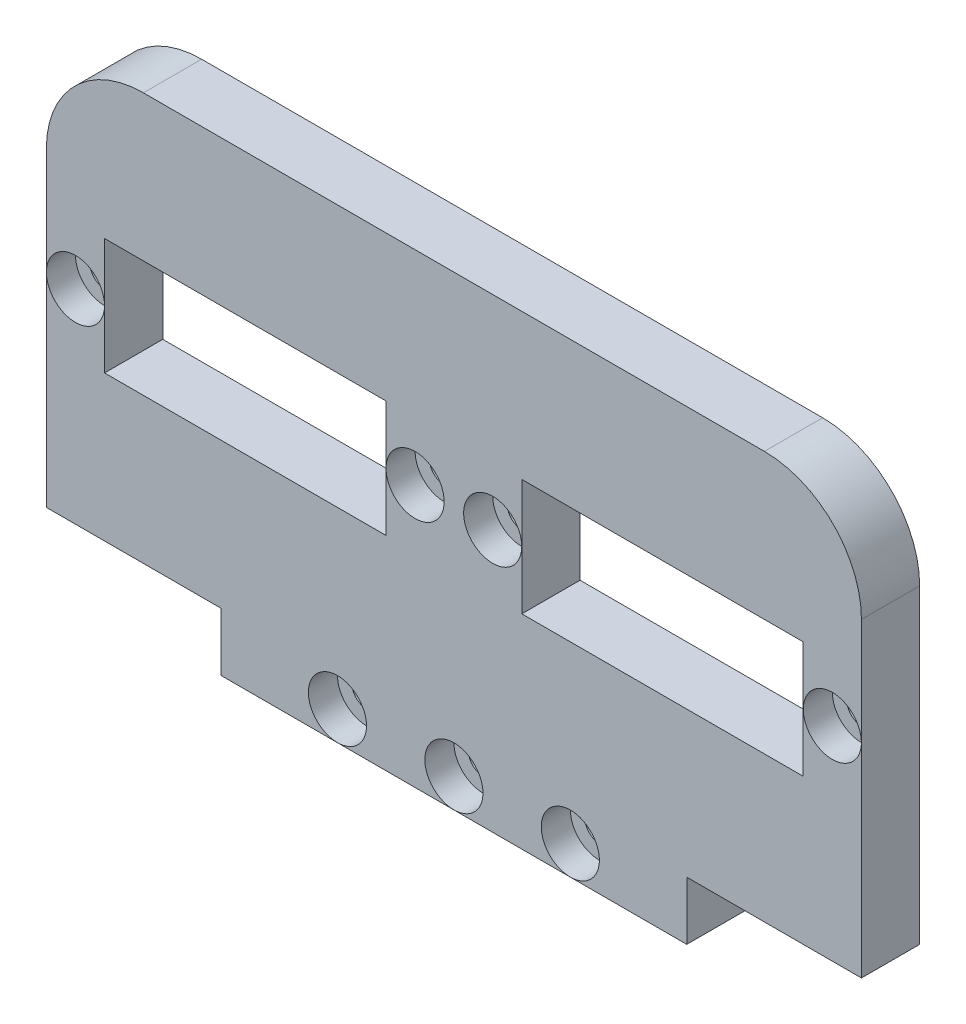
ISO-10303-21;
HEADER;
FILE_DESCRIPTION(('STEP AP214'),'2;1');
FILE_NAME('part.step','',(''),(''),'','','');
FILE_SCHEMA(('AUTOMOTIVE_DESIGN { 1 0 10303 214 1 1 1 1 }'));
ENDSEC;
DATA;
#1=APPLICATION_CONTEXT('core data for automotive mechanical design processes');
#2=APPLICATION_PROTOCOL_DEFINITION('international standard','automotive_design',2000,#1);
#3=PRODUCT_CONTEXT('',#1,'mechanical');
#4=PRODUCT('Part','Part','',(#3));
#5=PRODUCT_RELATED_PRODUCT_CATEGORY('part','',(#4));
#6=PRODUCT_DEFINITION_FORMATION('','',#4);
#7=PRODUCT_DEFINITION_CONTEXT('part definition',#1,'design');
#8=PRODUCT_DEFINITION('design','',#6,#7);
#9=PRODUCT_DEFINITION_SHAPE('','',#8);
#10=(LENGTH_UNIT() NAMED_UNIT(*) SI_UNIT(.MILLI.,.METRE.));
#11=(NAMED_UNIT(*) PLANE_ANGLE_UNIT() SI_UNIT($,.RADIAN.));
#12=(NAMED_UNIT(*) SI_UNIT($,.STERADIAN.) SOLID_ANGLE_UNIT());
#13=UNCERTAINTY_MEASURE_WITH_UNIT(LENGTH_MEASURE(1.E-05),#10,'distance_accuracy_value','');
#14=(GEOMETRIC_REPRESENTATION_CONTEXT(3) GLOBAL_UNCERTAINTY_ASSIGNED_CONTEXT((#13)) GLOBAL_UNIT_ASSIGNED_CONTEXT((#10,
#11,#12)) REPRESENTATION_CONTEXT('',''));
#15=CARTESIAN_POINT('',(0.,0.,0.));
#16=DIRECTION('',(0.,0.,1.));
#17=DIRECTION('',(1.,0.,0.));
#18=AXIS2_PLACEMENT_3D('',#15,#16,#17);
#19=CARTESIAN_POINT('',(49.587382635231,13.131926121372,0.));
#20=DIRECTION('',(0.,0.,1.));
#21=DIRECTION('',(1.,0.,0.));
#22=AXIS2_PLACEMENT_3D('',#19,#20,#21);
#23=CYLINDRICAL_SURFACE('',#22,1.5);
#24=CARTESIAN_POINT('',(49.587382635231,13.131926121372,0.));
#25=DIRECTION('',(0.,0.,1.));
#26=DIRECTION('',(1.,0.,0.));
#27=AXIS2_PLACEMENT_3D('',#24,#25,#26);
#28=CIRCLE('',#27,1.5);
#29=CARTESIAN_POINT('',(51.087382635231,13.131926121372,0.));
#30=VERTEX_POINT('',#29);
#31=EDGE_CURVE('E574',#30,#30,#28,.T.);
#32=ORIENTED_EDGE('',*,*,#31,.F.);
#33=EDGE_LOOP('',(#32));
#34=FACE_BOUND('',#33,.T.);
#35=CARTESIAN_POINT('',(49.587382635231,13.131926121372,3.));
#36=DIRECTION('',(0.,0.,1.));
#37=DIRECTION('',(1.,0.,0.));
#38=AXIS2_PLACEMENT_3D('',#35,#36,#37);
#39=CIRCLE('',#38,1.5);
#40=CARTESIAN_POINT('',(51.087382635231,13.131926121372,3.));
#41=VERTEX_POINT('',#40);
#42=EDGE_CURVE('E328',#41,#41,#39,.F.);
#43=ORIENTED_EDGE('',*,*,#42,.F.);
#44=EDGE_LOOP('',(#43));
#45=FACE_BOUND('',#44,.T.);
#46=ADVANCED_FACE('F35',(#34,#45),#23,.F.);
#47=CARTESIAN_POINT('',(14.587382635231,13.131926121372,0.));
#48=DIRECTION('',(0.,0.,1.));
#49=DIRECTION('',(1.,0.,0.));
#50=AXIS2_PLACEMENT_3D('',#47,#48,#49);
#51=CYLINDRICAL_SURFACE('',#50,1.5);
#52=CARTESIAN_POINT('',(14.587382635231,13.131926121372,0.));
#53=DIRECTION('',(0.,0.,1.));
#54=DIRECTION('',(1.,0.,0.));
#55=AXIS2_PLACEMENT_3D('',#52,#53,#54);
#56=CIRCLE('',#55,1.5);
#57=CARTESIAN_POINT('',(16.087382635231,13.131926121372,0.));
#58=VERTEX_POINT('',#57);
#59=EDGE_CURVE('E569',#58,#58,#56,.T.);
#60=ORIENTED_EDGE('',*,*,#59,.F.);
#61=EDGE_LOOP('',(#60));
#62=FACE_BOUND('',#61,.T.);
#63=CARTESIAN_POINT('',(14.587382635231,13.131926121372,3.));
#64=DIRECTION('',(0.,0.,1.));
#65=DIRECTION('',(1.,0.,0.));
#66=AXIS2_PLACEMENT_3D('',#63,#64,#65);
#67=CIRCLE('',#66,1.5);
#68=CARTESIAN_POINT('',(16.087382635231,13.131926121372,3.));
#69=VERTEX_POINT('',#68);
#70=EDGE_CURVE('E323',#69,#69,#67,.F.);
#71=ORIENTED_EDGE('',*,*,#70,.F.);
#72=EDGE_LOOP('',(#71));
#73=FACE_BOUND('',#72,.T.);
#74=ADVANCED_FACE('F387',(#62,#73),#51,.F.);
#75=CARTESIAN_POINT('',(6.58738263523099,13.131926121372,0.));
#76=DIRECTION('',(0.,0.,1.));
#77=DIRECTION('',(1.,0.,0.));
#78=AXIS2_PLACEMENT_3D('',#75,#76,#77);
#79=CYLINDRICAL_SURFACE('',#78,1.5);
#80=CARTESIAN_POINT('',(6.58738263523099,13.131926121372,0.));
#81=DIRECTION('',(0.,0.,1.));
#82=DIRECTION('',(1.,0.,0.));
#83=AXIS2_PLACEMENT_3D('',#80,#81,#82);
#84=CIRCLE('',#83,1.5);
#85=CARTESIAN_POINT('',(8.08738263523099,13.131926121372,0.));
#86=VERTEX_POINT('',#85);
#87=EDGE_CURVE('E572',#86,#86,#84,.T.);
#88=ORIENTED_EDGE('',*,*,#87,.F.);
#89=EDGE_LOOP('',(#88));
#90=FACE_BOUND('',#89,.T.);
#91=CARTESIAN_POINT('',(6.58738263523099,13.131926121372,3.));
#92=DIRECTION('',(0.,0.,1.));
#93=DIRECTION('',(1.,0.,0.));
#94=AXIS2_PLACEMENT_3D('',#91,#92,#93);
#95=CIRCLE('',#94,1.5);
#96=CARTESIAN_POINT('',(8.08738263523099,13.131926121372,3.));
#97=VERTEX_POINT('',#96);
#98=EDGE_CURVE('E318',#97,#97,#95,.F.);
#99=ORIENTED_EDGE('',*,*,#98,.F.);
#100=EDGE_LOOP('',(#99));
#101=FACE_BOUND('',#100,.T.);
#102=ADVANCED_FACE('F393',(#90,#101),#79,.F.);
#103=CARTESIAN_POINT('',(-28.412617364769,13.131926121372,0.));
#104=DIRECTION('',(0.,0.,1.));
#105=DIRECTION('',(1.,0.,0.));
#106=AXIS2_PLACEMENT_3D('',#103,#104,#105);
#107=CYLINDRICAL_SURFACE('',#106,1.5);
#108=CARTESIAN_POINT('',(-28.412617364769,13.131926121372,0.));
#109=DIRECTION('',(0.,0.,1.));
#110=DIRECTION('',(1.,0.,0.));
#111=AXIS2_PLACEMENT_3D('',#108,#109,#110);
#112=CIRCLE('',#111,1.5);
#113=CARTESIAN_POINT('',(-26.912617364769,13.131926121372,0.));
#114=VERTEX_POINT('',#113);
#115=EDGE_CURVE('E194',#114,#114,#112,.T.);
#116=ORIENTED_EDGE('',*,*,#115,.F.);
#117=EDGE_LOOP('',(#116));
#118=FACE_BOUND('',#117,.T.);
#119=CARTESIAN_POINT('',(-28.412617364769,13.131926121372,3.));
#120=DIRECTION('',(0.,0.,1.));
#121=DIRECTION('',(1.,0.,0.));
#122=AXIS2_PLACEMENT_3D('',#119,#120,#121);
#123=CIRCLE('',#122,1.5);
#124=CARTESIAN_POINT('',(-26.912617364769,13.131926121372,3.));
#125=VERTEX_POINT('',#124);
#126=EDGE_CURVE('E313',#125,#125,#123,.F.);
#127=ORIENTED_EDGE('',*,*,#126,.F.);
#128=EDGE_LOOP('',(#127));
#129=FACE_BOUND('',#128,.T.);
#130=ADVANCED_FACE('F400',(#118,#129),#107,.F.);
#131=CARTESIAN_POINT('',(10.587382635231,-10.868073878628,0.));
#132=DIRECTION('',(0.,0.,1.));
#133=DIRECTION('',(1.,0.,0.));
#134=AXIS2_PLACEMENT_3D('',#131,#132,#133);
#135=CYLINDRICAL_SURFACE('',#134,1.5);
#136=CARTESIAN_POINT('',(10.587382635231,-10.868073878628,0.));
#137=DIRECTION('',(0.,0.,1.));
#138=DIRECTION('',(1.,0.,0.));
#139=AXIS2_PLACEMENT_3D('',#136,#137,#138);
#140=CIRCLE('',#139,1.5);
#141=CARTESIAN_POINT('',(12.087382635231,-10.868073878628,0.));
#142=VERTEX_POINT('',#141);
#143=EDGE_CURVE('E301',#142,#142,#140,.T.);
#144=ORIENTED_EDGE('',*,*,#143,.F.);
#145=EDGE_LOOP('',(#144));
#146=FACE_BOUND('',#145,.T.);
#147=CARTESIAN_POINT('',(10.587382635231,-10.868073878628,3.));
#148=DIRECTION('',(0.,0.,1.));
#149=DIRECTION('',(1.,0.,0.));
#150=AXIS2_PLACEMENT_3D('',#147,#148,#149);
#151=CIRCLE('',#150,1.5);
#152=CARTESIAN_POINT('',(12.087382635231,-10.868073878628,3.));
#153=VERTEX_POINT('',#152);
#154=EDGE_CURVE('E308',#153,#153,#151,.F.);
#155=ORIENTED_EDGE('',*,*,#154,.F.);
#156=EDGE_LOOP('',(#155));
#157=FACE_BOUND('',#156,.T.);
#158=ADVANCED_FACE('F403',(#146,#157),#135,.F.);
#159=CARTESIAN_POINT('',(22.587382635231,-10.868073878628,0.));
#160=DIRECTION('',(0.,0.,1.));
#161=DIRECTION('',(1.,0.,0.));
#162=AXIS2_PLACEMENT_3D('',#159,#160,#161);
#163=CYLINDRICAL_SURFACE('',#162,1.5);
#164=CARTESIAN_POINT('',(22.587382635231,-10.868073878628,0.));
#165=DIRECTION('',(0.,0.,1.));
#166=DIRECTION('',(-1.,0.,0.));
#167=AXIS2_PLACEMENT_3D('',#164,#165,#166);
#168=CIRCLE('',#167,1.5);
#169=CARTESIAN_POINT('',(21.087382635231,-10.868073878628,0.));
#170=VERTEX_POINT('',#169);
#171=EDGE_CURVE('E563',#170,#170,#168,.T.);
#172=ORIENTED_EDGE('',*,*,#171,.F.);
#173=EDGE_LOOP('',(#172));
#174=FACE_BOUND('',#173,.T.);
#175=CARTESIAN_POINT('',(22.587382635231,-10.868073878628,3.));
#176=DIRECTION('',(0.,0.,1.));
#177=DIRECTION('',(1.,0.,0.));
#178=AXIS2_PLACEMENT_3D('',#175,#176,#177);
#179=CIRCLE('',#178,1.5);
#180=CARTESIAN_POINT('',(24.087382635231,-10.868073878628,3.));
#181=VERTEX_POINT('',#180);
#182=EDGE_CURVE('E303',#181,#181,#179,.F.);
#183=ORIENTED_EDGE('',*,*,#182,.F.);
#184=EDGE_LOOP('',(#183));
#185=FACE_BOUND('',#184,.T.);
#186=ADVANCED_FACE('F459',(#174,#185),#163,.F.);
#187=CARTESIAN_POINT('',(-1.412617364769,-10.868073878628,0.));
#188=DIRECTION('',(0.,0.,1.));
#189=DIRECTION('',(1.,0.,0.));
#190=AXIS2_PLACEMENT_3D('',#187,#188,#189);
#191=CYLINDRICAL_SURFACE('',#190,1.5);
#192=CARTESIAN_POINT('',(-1.412617364769,-10.868073878628,0.));
#193=DIRECTION('',(0.,0.,1.));
#194=DIRECTION('',(1.,0.,0.));
#195=AXIS2_PLACEMENT_3D('',#192,#193,#194);
#196=CIRCLE('',#195,1.5);
#197=CARTESIAN_POINT('',(0.0873826352310041,-10.868073878628,0.));
#198=VERTEX_POINT('',#197);
#199=EDGE_CURVE('E566',#198,#198,#196,.T.);
#200=ORIENTED_EDGE('',*,*,#199,.F.);
#201=EDGE_LOOP('',(#200));
#202=FACE_BOUND('',#201,.T.);
#203=CARTESIAN_POINT('',(-1.412617364769,-10.868073878628,3.));
#204=DIRECTION('',(0.,0.,1.));
#205=DIRECTION('',(1.,0.,0.));
#206=AXIS2_PLACEMENT_3D('',#203,#204,#205);
#207=CIRCLE('',#206,1.5);
#208=CARTESIAN_POINT('',(0.0873826352310041,-10.868073878628,3.));
#209=VERTEX_POINT('',#208);
#210=EDGE_CURVE('E298',#209,#209,#207,.F.);
#211=ORIENTED_EDGE('',*,*,#210,.F.);
#212=EDGE_LOOP('',(#211));
#213=FACE_BOUND('',#212,.T.);
#214=ADVANCED_FACE('F455',(#202,#213),#191,.F.);
#215=CARTESIAN_POINT('',(-31.412617364769,34.131926121372,6.));
#216=DIRECTION('',(1.,0.,0.));
#217=DIRECTION('',(0.,1.,0.));
#218=AXIS2_PLACEMENT_3D('',#215,#216,#217);
#219=PLANE('',#218);
#220=DIRECTION('',(0.,-1.,0.));
#221=VECTOR('',#220,1.);
#222=CARTESIAN_POINT('',(-31.412617364769,34.131926121372,6.));
#223=LINE('',#222,#221);
#224=CARTESIAN_POINT('',(-31.412617364769,24.131926121372,6.));
#225=VERTEX_POINT('',#224);
#226=CARTESIAN_POINT('',(-31.412617364769,-7.86807387862796,6.));
#227=VERTEX_POINT('',#226);
#228=EDGE_CURVE('E279',#225,#227,#223,.T.);
#229=ORIENTED_EDGE('',*,*,#228,.F.);
#230=DIRECTION('',(0.,0.,-1.));
#231=VECTOR('',#230,1.);
#232=CARTESIAN_POINT('',(-31.412617364769,24.131926121372,6.));
#233=LINE('',#232,#231);
#234=CARTESIAN_POINT('',(-31.412617364769,24.131926121372,0.));
#235=VERTEX_POINT('',#234);
#236=EDGE_CURVE('E11',#225,#235,#233,.T.);
#237=ORIENTED_EDGE('',*,*,#236,.T.);
#238=DIRECTION('',(0.,-1.,0.));
#239=VECTOR('',#238,1.);
#240=CARTESIAN_POINT('',(-31.412617364769,34.131926121372,0.));
#241=LINE('',#240,#239);
#242=CARTESIAN_POINT('',(-31.412617364769,-7.86807387862796,0.));
#243=VERTEX_POINT('',#242);
#244=EDGE_CURVE('E275',#235,#243,#241,.T.);
#245=ORIENTED_EDGE('',*,*,#244,.T.);
#246=DIRECTION('',(0.,0.,1.));
#247=VECTOR('',#246,1.);
#248=CARTESIAN_POINT('',(-31.412617364769,-7.86807387862796,0.));
#249=LINE('',#248,#247);
#250=EDGE_CURVE('E272',#243,#227,#249,.T.);
#251=ORIENTED_EDGE('',*,*,#250,.T.);
#252=EDGE_LOOP('',(#229,#237,#245,#251));
#253=FACE_BOUND('',#252,.T.);
#254=ADVANCED_FACE('F378',(#253),#219,.F.);
#255=CARTESIAN_POINT('',(-31.412617364769,-13.868073878628,6.));
#256=DIRECTION('',(0.,1.,0.));
#257=DIRECTION('',(0.,0.,1.));
#258=AXIS2_PLACEMENT_3D('',#255,#256,#257);
#259=PLANE('',#258);
#260=DIRECTION('',(1.,0.,0.));
#261=VECTOR('',#260,1.);
#262=CARTESIAN_POINT('',(-31.412617364769,-13.868073878628,0.));
#263=LINE('',#262,#261);
#264=CARTESIAN_POINT('',(-13.412617364769,-13.868073878628,0.));
#265=VERTEX_POINT('',#264);
#266=CARTESIAN_POINT('',(34.587382635231,-13.868073878628,0.));
#267=VERTEX_POINT('',#266);
#268=EDGE_CURVE('E291',#265,#267,#263,.T.);
#269=ORIENTED_EDGE('',*,*,#268,.T.);
#270=DIRECTION('',(0.,0.,1.));
#271=VECTOR('',#270,1.);
#272=CARTESIAN_POINT('',(34.587382635231,-13.868073878628,0.));
#273=LINE('',#272,#271);
#274=CARTESIAN_POINT('',(34.587382635231,-13.868073878628,6.));
#275=VERTEX_POINT('',#274);
#276=EDGE_CURVE('E253',#267,#275,#273,.T.);
#277=ORIENTED_EDGE('',*,*,#276,.T.);
#278=DIRECTION('',(1.,0.,0.));
#279=VECTOR('',#278,1.);
#280=CARTESIAN_POINT('',(-31.412617364769,-13.868073878628,6.));
#281=LINE('',#280,#279);
#282=CARTESIAN_POINT('',(-13.412617364769,-13.868073878628,6.));
#283=VERTEX_POINT('',#282);
#284=EDGE_CURVE('E281',#283,#275,#281,.T.);
#285=ORIENTED_EDGE('',*,*,#284,.F.);
#286=DIRECTION('',(0.,0.,1.));
#287=VECTOR('',#286,1.);
#288=CARTESIAN_POINT('',(-13.412617364769,-13.868073878628,0.));
#289=LINE('',#288,#287);
#290=EDGE_CURVE('E267',#265,#283,#289,.T.);
#291=ORIENTED_EDGE('',*,*,#290,.F.);
#292=EDGE_LOOP('',(#269,#277,#285,#291));
#293=FACE_BOUND('',#292,.T.);
#294=ADVANCED_FACE('F366',(#293),#259,.F.);
#295=CARTESIAN_POINT('',(52.587382635231,34.131926121372,6.));
#296=DIRECTION('',(-1.,0.,0.));
#297=DIRECTION('',(0.,0.,1.));
#298=AXIS2_PLACEMENT_3D('',#295,#296,#297);
#299=PLANE('',#298);
#300=DIRECTION('',(0.,1.,0.));
#301=VECTOR('',#300,1.);
#302=CARTESIAN_POINT('',(52.587382635231,34.131926121372,0.));
#303=LINE('',#302,#301);
#304=CARTESIAN_POINT('',(52.587382635231,-7.86807387862796,0.));
#305=VERTEX_POINT('',#304);
#306=CARTESIAN_POINT('',(52.587382635231,24.131926121372,0.));
#307=VERTEX_POINT('',#306);
#308=EDGE_CURVE('E294',#305,#307,#303,.T.);
#309=ORIENTED_EDGE('',*,*,#308,.T.);
#310=DIRECTION('',(0.,0.,-1.));
#311=VECTOR('',#310,1.);
#312=CARTESIAN_POINT('',(52.587382635231,24.131926121372,6.));
#313=LINE('',#312,#311);
#314=CARTESIAN_POINT('',(52.587382635231,24.131926121372,6.));
#315=VERTEX_POINT('',#314);
#316=EDGE_CURVE('E58',#307,#315,#313,.F.);
#317=ORIENTED_EDGE('',*,*,#316,.T.);
#318=DIRECTION('',(0.,1.,0.));
#319=VECTOR('',#318,1.);
#320=CARTESIAN_POINT('',(52.587382635231,34.131926121372,6.));
#321=LINE('',#320,#319);
#322=CARTESIAN_POINT('',(52.587382635231,-7.86807387862796,6.));
#323=VERTEX_POINT('',#322);
#324=EDGE_CURVE('E285',#323,#315,#321,.T.);
#325=ORIENTED_EDGE('',*,*,#324,.F.);
#326=DIRECTION('',(0.,0.,1.));
#327=VECTOR('',#326,1.);
#328=CARTESIAN_POINT('',(52.587382635231,-7.86807387862796,0.));
#329=LINE('',#328,#327);
#330=EDGE_CURVE('E249',#305,#323,#329,.T.);
#331=ORIENTED_EDGE('',*,*,#330,.F.);
#332=EDGE_LOOP('',(#309,#317,#325,#331));
#333=FACE_BOUND('',#332,.T.);
#334=ADVANCED_FACE('F356',(#333),#299,.F.);
#335=CARTESIAN_POINT('',(-31.412617364769,34.131926121372,6.));
#336=DIRECTION('',(0.,-1.,0.));
#337=DIRECTION('',(0.,0.,-1.));
#338=AXIS2_PLACEMENT_3D('',#335,#336,#337);
#339=PLANE('',#338);
#340=DIRECTION('',(-1.,0.,0.));
#341=VECTOR('',#340,1.);
#342=CARTESIAN_POINT('',(-31.412617364769,34.131926121372,6.));
#343=LINE('',#342,#341);
#344=CARTESIAN_POINT('',(42.587382635231,34.131926121372,6.));
#345=VERTEX_POINT('',#344);
#346=CARTESIAN_POINT('',(-21.412617364769,34.131926121372,6.));
#347=VERTEX_POINT('',#346);
#348=EDGE_CURVE('E287',#345,#347,#343,.T.);
#349=ORIENTED_EDGE('',*,*,#348,.F.);
#350=DIRECTION('',(0.,0.,-1.));
#351=VECTOR('',#350,1.);
#352=CARTESIAN_POINT('',(42.587382635231,34.131926121372,6.));
#353=LINE('',#352,#351);
#354=CARTESIAN_POINT('',(42.587382635231,34.131926121372,0.));
#355=VERTEX_POINT('',#354);
#356=EDGE_CURVE('E334',#345,#355,#353,.T.);
#357=ORIENTED_EDGE('',*,*,#356,.T.);
#358=DIRECTION('',(-1.,0.,0.));
#359=VECTOR('',#358,1.);
#360=CARTESIAN_POINT('',(-31.412617364769,34.131926121372,0.));
#361=LINE('',#360,#359);
#362=CARTESIAN_POINT('',(-21.412617364769,34.131926121372,0.));
#363=VERTEX_POINT('',#362);
#364=EDGE_CURVE('E282',#355,#363,#361,.T.);
#365=ORIENTED_EDGE('',*,*,#364,.T.);
#366=DIRECTION('',(0.,0.,-1.));
#367=VECTOR('',#366,1.);
#368=CARTESIAN_POINT('',(-21.412617364769,34.131926121372,6.));
#369=LINE('',#368,#367);
#370=EDGE_CURVE('E289',#363,#347,#369,.F.);
#371=ORIENTED_EDGE('',*,*,#370,.T.);
#372=EDGE_LOOP('',(#349,#357,#365,#371));
#373=FACE_BOUND('',#372,.T.);
#374=ADVANCED_FACE('F349',(#373),#339,.F.);
#375=CARTESIAN_POINT('',(0.,0.,6.));
#376=DIRECTION('',(0.,0.,1.));
#377=DIRECTION('',(1.,0.,0.));
#378=AXIS2_PLACEMENT_3D('',#375,#376,#377);
#379=PLANE('',#378);
#380=CARTESIAN_POINT('',(49.587382635231,13.131926121372,6.));
#381=DIRECTION('',(0.,0.,1.));
#382=DIRECTION('',(1.,0.,0.));
#383=AXIS2_PLACEMENT_3D('',#380,#381,#382);
#384=CIRCLE('',#383,2.995);
#385=CARTESIAN_POINT('',(52.582382635231,13.131926121372,6.));
#386=VERTEX_POINT('',#385);
#387=EDGE_CURVE('E532',#386,#386,#384,.T.);
#388=ORIENTED_EDGE('',*,*,#387,.F.);
#389=EDGE_LOOP('',(#388));
#390=FACE_BOUND('',#389,.T.);
#391=CARTESIAN_POINT('',(14.587382635231,13.131926121372,6.));
#392=DIRECTION('',(0.,0.,1.));
#393=DIRECTION('',(1.,0.,0.));
#394=AXIS2_PLACEMENT_3D('',#391,#392,#393);
#395=CIRCLE('',#394,2.995);
#396=CARTESIAN_POINT('',(17.582382635231,13.131926121372,6.));
#397=VERTEX_POINT('',#396);
#398=EDGE_CURVE('E331',#397,#397,#395,.T.);
#399=ORIENTED_EDGE('',*,*,#398,.F.);
#400=EDGE_LOOP('',(#399));
#401=FACE_BOUND('',#400,.T.);
#402=CARTESIAN_POINT('',(6.58738263523099,13.131926121372,6.));
#403=DIRECTION('',(0.,0.,1.));
#404=DIRECTION('',(1.,0.,0.));
#405=AXIS2_PLACEMENT_3D('',#402,#403,#404);
#406=CIRCLE('',#405,2.995);
#407=CARTESIAN_POINT('',(9.58238263523099,13.131926121372,6.));
#408=VERTEX_POINT('',#407);
#409=EDGE_CURVE('E326',#408,#408,#406,.T.);
#410=ORIENTED_EDGE('',*,*,#409,.F.);
#411=EDGE_LOOP('',(#410));
#412=FACE_BOUND('',#411,.T.);
#413=CARTESIAN_POINT('',(-28.412617364769,13.131926121372,6.));
#414=DIRECTION('',(0.,0.,1.));
#415=DIRECTION('',(1.,0.,0.));
#416=AXIS2_PLACEMENT_3D('',#413,#414,#415);
#417=CIRCLE('',#416,2.995);
#418=CARTESIAN_POINT('',(-25.417617364769,13.131926121372,6.));
#419=VERTEX_POINT('',#418);
#420=EDGE_CURVE('E321',#419,#419,#417,.T.);
#421=ORIENTED_EDGE('',*,*,#420,.F.);
#422=EDGE_LOOP('',(#421));
#423=FACE_BOUND('',#422,.T.);
#424=CARTESIAN_POINT('',(10.587382635231,-10.868073878628,6.));
#425=DIRECTION('',(0.,0.,1.));
#426=DIRECTION('',(1.,0.,0.));
#427=AXIS2_PLACEMENT_3D('',#424,#425,#426);
#428=CIRCLE('',#427,2.995);
#429=CARTESIAN_POINT('',(13.582382635231,-10.868073878628,6.));
#430=VERTEX_POINT('',#429);
#431=EDGE_CURVE('E316',#430,#430,#428,.T.);
#432=ORIENTED_EDGE('',*,*,#431,.F.);
#433=EDGE_LOOP('',(#432));
#434=FACE_BOUND('',#433,.T.);
#435=CARTESIAN_POINT('',(22.587382635231,-10.868073878628,6.));
#436=DIRECTION('',(0.,0.,1.));
#437=DIRECTION('',(1.,0.,0.));
#438=AXIS2_PLACEMENT_3D('',#435,#436,#437);
#439=CIRCLE('',#438,2.995);
#440=CARTESIAN_POINT('',(25.582382635231,-10.868073878628,6.));
#441=VERTEX_POINT('',#440);
#442=EDGE_CURVE('E311',#441,#441,#439,.T.);
#443=ORIENTED_EDGE('',*,*,#442,.F.);
#444=EDGE_LOOP('',(#443));
#445=FACE_BOUND('',#444,.T.);
#446=CARTESIAN_POINT('',(-1.412617364769,-10.868073878628,6.));
#447=DIRECTION('',(0.,0.,1.));
#448=DIRECTION('',(1.,0.,0.));
#449=AXIS2_PLACEMENT_3D('',#446,#447,#448);
#450=CIRCLE('',#449,2.995);
#451=CARTESIAN_POINT('',(1.582382635231,-10.868073878628,6.));
#452=VERTEX_POINT('',#451);
#453=EDGE_CURVE('E306',#452,#452,#450,.T.);
#454=ORIENTED_EDGE('',*,*,#453,.F.);
#455=EDGE_LOOP('',(#454));
#456=FACE_BOUND('',#455,.T.);
#457=DIRECTION('',(0.,-1.,0.));
#458=VECTOR('',#457,1.);
#459=CARTESIAN_POINT('',(17.587382635231,19.131926121372,6.));
#460=LINE('',#459,#458);
#461=CARTESIAN_POINT('',(17.587382635231,19.131926121372,6.));
#462=VERTEX_POINT('',#461);
#463=CARTESIAN_POINT('',(17.587382635231,7.13192612137204,6.));
#464=VERTEX_POINT('',#463);
#465=EDGE_CURVE('E170',#462,#464,#460,.T.);
#466=ORIENTED_EDGE('',*,*,#465,.F.);
#467=DIRECTION('',(-1.,0.,0.));
#468=VECTOR('',#467,1.);
#469=CARTESIAN_POINT('',(17.587382635231,19.131926121372,6.));
#470=LINE('',#469,#468);
#471=CARTESIAN_POINT('',(46.587382635231,19.131926121372,6.));
#472=VERTEX_POINT('',#471);
#473=EDGE_CURVE('E188',#472,#462,#470,.T.);
#474=ORIENTED_EDGE('',*,*,#473,.F.);
#475=DIRECTION('',(0.,1.,0.));
#476=VECTOR('',#475,1.);
#477=CARTESIAN_POINT('',(46.587382635231,19.131926121372,6.));
#478=LINE('',#477,#476);
#479=CARTESIAN_POINT('',(46.587382635231,7.13192612137204,6.));
#480=VERTEX_POINT('',#479);
#481=EDGE_CURVE('E191',#480,#472,#478,.T.);
#482=ORIENTED_EDGE('',*,*,#481,.F.);
#483=DIRECTION('',(1.,0.,0.));
#484=VECTOR('',#483,1.);
#485=CARTESIAN_POINT('',(17.587382635231,7.13192612137204,6.));
#486=LINE('',#485,#484);
#487=EDGE_CURVE('E200',#464,#480,#486,.T.);
#488=ORIENTED_EDGE('',*,*,#487,.F.);
#489=EDGE_LOOP('',(#466,#474,#482,#488));
#490=FACE_BOUND('',#489,.T.);
#491=DIRECTION('',(0.,-1.,0.));
#492=VECTOR('',#491,1.);
#493=CARTESIAN_POINT('',(-25.412617364769,19.131926121372,6.));
#494=LINE('',#493,#492);
#495=CARTESIAN_POINT('',(-25.412617364769,19.131926121372,6.));
#496=VERTEX_POINT('',#495);
#497=CARTESIAN_POINT('',(-25.412617364769,7.13192612137204,6.));
#498=VERTEX_POINT('',#497);
#499=EDGE_CURVE('E206',#496,#498,#494,.T.);
#500=ORIENTED_EDGE('',*,*,#499,.F.);
#501=DIRECTION('',(-1.,0.,0.));
#502=VECTOR('',#501,1.);
#503=CARTESIAN_POINT('',(-25.412617364769,19.131926121372,6.));
#504=LINE('',#503,#502);
#505=CARTESIAN_POINT('',(3.58738263523099,19.131926121372,6.));
#506=VERTEX_POINT('',#505);
#507=EDGE_CURVE('E214',#506,#496,#504,.T.);
#508=ORIENTED_EDGE('',*,*,#507,.F.);
#509=DIRECTION('',(0.,1.,0.));
#510=VECTOR('',#509,1.);
#511=CARTESIAN_POINT('',(3.58738263523099,19.131926121372,6.));
#512=LINE('',#511,#510);
#513=CARTESIAN_POINT('',(3.58738263523099,7.13192612137204,6.));
#514=VERTEX_POINT('',#513);
#515=EDGE_CURVE('E228',#514,#506,#512,.T.);
#516=ORIENTED_EDGE('',*,*,#515,.F.);
#517=DIRECTION('',(1.,0.,0.));
#518=VECTOR('',#517,1.);
#519=CARTESIAN_POINT('',(-25.412617364769,7.13192612137204,6.));
#520=LINE('',#519,#518);
#521=EDGE_CURVE('E225',#498,#514,#520,.T.);
#522=ORIENTED_EDGE('',*,*,#521,.F.);
#523=EDGE_LOOP('',(#500,#508,#516,#522));
#524=FACE_BOUND('',#523,.T.);
#525=ORIENTED_EDGE('',*,*,#324,.T.);
#526=CARTESIAN_POINT('',(42.587382635231,24.131926121372,6.));
#527=DIRECTION('',(0.,0.,1.));
#528=DIRECTION('',(1.,0.,0.));
#529=AXIS2_PLACEMENT_3D('',#526,#527,#528);
#530=CIRCLE('',#529,10.);
#531=EDGE_CURVE('E43',#315,#345,#530,.T.);
#532=ORIENTED_EDGE('',*,*,#531,.T.);
#533=ORIENTED_EDGE('',*,*,#348,.T.);
#534=CARTESIAN_POINT('',(-21.412617364769,24.131926121372,6.));
#535=DIRECTION('',(0.,0.,1.));
#536=DIRECTION('',(1.,0.,0.));
#537=AXIS2_PLACEMENT_3D('',#534,#535,#536);
#538=CIRCLE('',#537,10.);
#539=EDGE_CURVE('E50',#347,#225,#538,.T.);
#540=ORIENTED_EDGE('',*,*,#539,.T.);
#541=ORIENTED_EDGE('',*,*,#228,.T.);
#542=DIRECTION('',(-1.,0.,0.));
#543=VECTOR('',#542,1.);
#544=CARTESIAN_POINT('',(-31.412617364769,-7.86807387862796,6.));
#545=LINE('',#544,#543);
#546=CARTESIAN_POINT('',(-13.412617364769,-7.86807387862796,6.));
#547=VERTEX_POINT('',#546);
#548=EDGE_CURVE('E264',#547,#227,#545,.T.);
#549=ORIENTED_EDGE('',*,*,#548,.F.);
#550=DIRECTION('',(0.,1.,0.));
#551=VECTOR('',#550,1.);
#552=CARTESIAN_POINT('',(-13.412617364769,-13.868073878628,6.));
#553=LINE('',#552,#551);
#554=EDGE_CURVE('E256',#283,#547,#553,.T.);
#555=ORIENTED_EDGE('',*,*,#554,.F.);
#556=ORIENTED_EDGE('',*,*,#284,.T.);
#557=DIRECTION('',(0.,-1.,0.));
#558=VECTOR('',#557,1.);
#559=CARTESIAN_POINT('',(34.587382635231,-13.868073878628,6.));
#560=LINE('',#559,#558);
#561=CARTESIAN_POINT('',(34.587382635231,-7.86807387862796,6.));
#562=VERTEX_POINT('',#561);
#563=EDGE_CURVE('E246',#562,#275,#560,.T.);
#564=ORIENTED_EDGE('',*,*,#563,.F.);
#565=DIRECTION('',(-1.,0.,0.));
#566=VECTOR('',#565,1.);
#567=CARTESIAN_POINT('',(52.587382635231,-7.86807387862796,6.));
#568=LINE('',#567,#566);
#569=EDGE_CURVE('E235',#323,#562,#568,.T.);
#570=ORIENTED_EDGE('',*,*,#569,.F.);
#571=EDGE_LOOP('',(#525,#532,#533,#540,#541,#549,#555,#556,#564,#570));
#572=FACE_BOUND('',#571,.T.);
#573=ADVANCED_FACE('F344',(#390,#401,#412,#423,#434,#445,#456,#490,#524,#572),#379,.T.);
#574=CARTESIAN_POINT('',(0.,0.,0.));
#575=DIRECTION('',(0.,0.,1.));
#576=DIRECTION('',(1.,0.,0.));
#577=AXIS2_PLACEMENT_3D('',#574,#575,#576);
#578=PLANE('',#577);
#579=ORIENTED_EDGE('',*,*,#143,.T.);
#580=EDGE_LOOP('',(#579));
#581=FACE_BOUND('',#580,.T.);
#582=ORIENTED_EDGE('',*,*,#171,.T.);
#583=EDGE_LOOP('',(#582));
#584=FACE_BOUND('',#583,.T.);
#585=ORIENTED_EDGE('',*,*,#199,.T.);
#586=EDGE_LOOP('',(#585));
#587=FACE_BOUND('',#586,.T.);
#588=ORIENTED_EDGE('',*,*,#59,.T.);
#589=EDGE_LOOP('',(#588));
#590=FACE_BOUND('',#589,.T.);
#591=ORIENTED_EDGE('',*,*,#87,.T.);
#592=EDGE_LOOP('',(#591));
#593=FACE_BOUND('',#592,.T.);
#594=ORIENTED_EDGE('',*,*,#31,.T.);
#595=EDGE_LOOP('',(#594));
#596=FACE_BOUND('',#595,.T.);
#597=ORIENTED_EDGE('',*,*,#115,.T.);
#598=EDGE_LOOP('',(#597));
#599=FACE_BOUND('',#598,.T.);
#600=DIRECTION('',(-1.,0.,0.));
#601=VECTOR('',#600,1.);
#602=CARTESIAN_POINT('',(17.587382635231,19.131926121372,0.));
#603=LINE('',#602,#601);
#604=CARTESIAN_POINT('',(46.587382635231,19.131926121372,0.));
#605=VERTEX_POINT('',#604);
#606=CARTESIAN_POINT('',(17.587382635231,19.131926121372,0.));
#607=VERTEX_POINT('',#606);
#608=EDGE_CURVE('E175',#605,#607,#603,.T.);
#609=ORIENTED_EDGE('',*,*,#608,.T.);
#610=DIRECTION('',(0.,-1.,0.));
#611=VECTOR('',#610,1.);
#612=CARTESIAN_POINT('',(17.587382635231,19.131926121372,0.));
#613=LINE('',#612,#611);
#614=CARTESIAN_POINT('',(17.587382635231,7.13192612137204,0.));
#615=VERTEX_POINT('',#614);
#616=EDGE_CURVE('E167',#607,#615,#613,.T.);
#617=ORIENTED_EDGE('',*,*,#616,.T.);
#618=DIRECTION('',(1.,0.,0.));
#619=VECTOR('',#618,1.);
#620=CARTESIAN_POINT('',(17.587382635231,7.13192612137204,0.));
#621=LINE('',#620,#619);
#622=CARTESIAN_POINT('',(46.587382635231,7.13192612137204,0.));
#623=VERTEX_POINT('',#622);
#624=EDGE_CURVE('E179',#615,#623,#621,.T.);
#625=ORIENTED_EDGE('',*,*,#624,.T.);
#626=DIRECTION('',(0.,1.,0.));
#627=VECTOR('',#626,1.);
#628=CARTESIAN_POINT('',(46.587382635231,19.131926121372,0.));
#629=LINE('',#628,#627);
#630=EDGE_CURVE('E183',#623,#605,#629,.T.);
#631=ORIENTED_EDGE('',*,*,#630,.T.);
#632=EDGE_LOOP('',(#609,#617,#625,#631));
#633=FACE_BOUND('',#632,.T.);
#634=DIRECTION('',(-1.,0.,0.));
#635=VECTOR('',#634,1.);
#636=CARTESIAN_POINT('',(-25.412617364769,19.131926121372,0.));
#637=LINE('',#636,#635);
#638=CARTESIAN_POINT('',(3.58738263523099,19.131926121372,0.));
#639=VERTEX_POINT('',#638);
#640=CARTESIAN_POINT('',(-25.412617364769,19.131926121372,0.));
#641=VERTEX_POINT('',#640);
#642=EDGE_CURVE('E220',#639,#641,#637,.T.);
#643=ORIENTED_EDGE('',*,*,#642,.T.);
#644=DIRECTION('',(0.,-1.,0.));
#645=VECTOR('',#644,1.);
#646=CARTESIAN_POINT('',(-25.412617364769,19.131926121372,0.));
#647=LINE('',#646,#645);
#648=CARTESIAN_POINT('',(-25.412617364769,7.13192612137204,0.));
#649=VERTEX_POINT('',#648);
#650=EDGE_CURVE('E210',#641,#649,#647,.T.);
#651=ORIENTED_EDGE('',*,*,#650,.T.);
#652=DIRECTION('',(1.,0.,0.));
#653=VECTOR('',#652,1.);
#654=CARTESIAN_POINT('',(-25.412617364769,7.13192612137204,0.));
#655=LINE('',#654,#653);
#656=CARTESIAN_POINT('',(3.58738263523099,7.13192612137204,0.));
#657=VERTEX_POINT('',#656);
#658=EDGE_CURVE('E213',#649,#657,#655,.T.);
#659=ORIENTED_EDGE('',*,*,#658,.T.);
#660=DIRECTION('',(0.,1.,0.));
#661=VECTOR('',#660,1.);
#662=CARTESIAN_POINT('',(3.58738263523099,19.131926121372,0.));
#663=LINE('',#662,#661);
#664=EDGE_CURVE('E217',#657,#639,#663,.T.);
#665=ORIENTED_EDGE('',*,*,#664,.T.);
#666=EDGE_LOOP('',(#643,#651,#659,#665));
#667=FACE_BOUND('',#666,.T.);
#668=ORIENTED_EDGE('',*,*,#364,.F.);
#669=CARTESIAN_POINT('',(42.587382635231,24.131926121372,0.));
#670=DIRECTION('',(0.,0.,1.));
#671=DIRECTION('',(1.,0.,0.));
#672=AXIS2_PLACEMENT_3D('',#669,#670,#671);
#673=CIRCLE('',#672,10.);
#674=EDGE_CURVE('E339',#355,#307,#673,.F.);
#675=ORIENTED_EDGE('',*,*,#674,.T.);
#676=ORIENTED_EDGE('',*,*,#308,.F.);
#677=DIRECTION('',(-1.,0.,0.));
#678=VECTOR('',#677,1.);
#679=CARTESIAN_POINT('',(52.587382635231,-7.86807387862796,0.));
#680=LINE('',#679,#678);
#681=CARTESIAN_POINT('',(34.587382635231,-7.86807387862796,0.));
#682=VERTEX_POINT('',#681);
#683=EDGE_CURVE('E242',#305,#682,#680,.T.);
#684=ORIENTED_EDGE('',*,*,#683,.T.);
#685=DIRECTION('',(0.,-1.,0.));
#686=VECTOR('',#685,1.);
#687=CARTESIAN_POINT('',(34.587382635231,-13.868073878628,0.));
#688=LINE('',#687,#686);
#689=EDGE_CURVE('E245',#682,#267,#688,.T.);
#690=ORIENTED_EDGE('',*,*,#689,.T.);
#691=ORIENTED_EDGE('',*,*,#268,.F.);
#692=DIRECTION('',(0.,1.,0.));
#693=VECTOR('',#692,1.);
#694=CARTESIAN_POINT('',(-13.412617364769,-13.868073878628,0.));
#695=LINE('',#694,#693);
#696=CARTESIAN_POINT('',(-13.412617364769,-7.86807387862796,0.));
#697=VERTEX_POINT('',#696);
#698=EDGE_CURVE('E260',#265,#697,#695,.T.);
#699=ORIENTED_EDGE('',*,*,#698,.T.);
#700=DIRECTION('',(-1.,0.,0.));
#701=VECTOR('',#700,1.);
#702=CARTESIAN_POINT('',(-31.412617364769,-7.86807387862796,0.));
#703=LINE('',#702,#701);
#704=EDGE_CURVE('E263',#697,#243,#703,.T.);
#705=ORIENTED_EDGE('',*,*,#704,.T.);
#706=ORIENTED_EDGE('',*,*,#244,.F.);
#707=CARTESIAN_POINT('',(-21.412617364769,24.131926121372,0.));
#708=DIRECTION('',(0.,0.,1.));
#709=DIRECTION('',(1.,0.,0.));
#710=AXIS2_PLACEMENT_3D('',#707,#708,#709);
#711=CIRCLE('',#710,10.);
#712=EDGE_CURVE('E337',#235,#363,#711,.F.);
#713=ORIENTED_EDGE('',*,*,#712,.T.);
#714=EDGE_LOOP('',(#668,#675,#676,#684,#690,#691,#699,#705,#706,#713));
#715=FACE_BOUND('',#714,.T.);
#716=ADVANCED_FACE('F185',(#581,#584,#587,#590,#593,#596,#599,#633,#667,#715),#578,.F.);
#717=CARTESIAN_POINT('',(-31.412617364769,-7.86807387862796,0.));
#718=DIRECTION('',(0.,1.,0.));
#719=DIRECTION('',(0.,0.,1.));
#720=AXIS2_PLACEMENT_3D('',#717,#718,#719);
#721=PLANE('',#720);
#722=ORIENTED_EDGE('',*,*,#548,.T.);
#723=ORIENTED_EDGE('',*,*,#250,.F.);
#724=ORIENTED_EDGE('',*,*,#704,.F.);
#725=DIRECTION('',(0.,0.,1.));
#726=VECTOR('',#725,1.);
#727=CARTESIAN_POINT('',(-13.412617364769,-7.86807387862796,0.));
#728=LINE('',#727,#726);
#729=EDGE_CURVE('E276',#697,#547,#728,.T.);
#730=ORIENTED_EDGE('',*,*,#729,.T.);
#731=EDGE_LOOP('',(#722,#723,#724,#730));
#732=FACE_BOUND('',#731,.T.);
#733=ADVANCED_FACE('F375',(#732),#721,.F.);
#734=CARTESIAN_POINT('',(-13.412617364769,-13.868073878628,0.));
#735=DIRECTION('',(1.,0.,0.));
#736=DIRECTION('',(0.,0.,-1.));
#737=AXIS2_PLACEMENT_3D('',#734,#735,#736);
#738=PLANE('',#737);
#739=ORIENTED_EDGE('',*,*,#554,.T.);
#740=ORIENTED_EDGE('',*,*,#729,.F.);
#741=ORIENTED_EDGE('',*,*,#698,.F.);
#742=ORIENTED_EDGE('',*,*,#290,.T.);
#743=EDGE_LOOP('',(#739,#740,#741,#742));
#744=FACE_BOUND('',#743,.T.);
#745=ADVANCED_FACE('F372',(#744),#738,.F.);
#746=CARTESIAN_POINT('',(34.587382635231,-13.868073878628,0.));
#747=DIRECTION('',(-1.,0.,0.));
#748=DIRECTION('',(0.,0.,1.));
#749=AXIS2_PLACEMENT_3D('',#746,#747,#748);
#750=PLANE('',#749);
#751=ORIENTED_EDGE('',*,*,#563,.T.);
#752=ORIENTED_EDGE('',*,*,#276,.F.);
#753=ORIENTED_EDGE('',*,*,#689,.F.);
#754=DIRECTION('',(0.,0.,1.));
#755=VECTOR('',#754,1.);
#756=CARTESIAN_POINT('',(34.587382635231,-7.86807387862796,0.));
#757=LINE('',#756,#755);
#758=EDGE_CURVE('E257',#682,#562,#757,.T.);
#759=ORIENTED_EDGE('',*,*,#758,.T.);
#760=EDGE_LOOP('',(#751,#752,#753,#759));
#761=FACE_BOUND('',#760,.T.);
#762=ADVANCED_FACE('F364',(#761),#750,.F.);
#763=CARTESIAN_POINT('',(52.587382635231,-7.86807387862796,0.));
#764=DIRECTION('',(0.,1.,0.));
#765=DIRECTION('',(-1.,0.,0.));
#766=AXIS2_PLACEMENT_3D('',#763,#764,#765);
#767=PLANE('',#766);
#768=ORIENTED_EDGE('',*,*,#569,.T.);
#769=ORIENTED_EDGE('',*,*,#758,.F.);
#770=ORIENTED_EDGE('',*,*,#683,.F.);
#771=ORIENTED_EDGE('',*,*,#330,.T.);
#772=EDGE_LOOP('',(#768,#769,#770,#771));
#773=FACE_BOUND('',#772,.T.);
#774=ADVANCED_FACE('F358',(#773),#767,.F.);
#775=CARTESIAN_POINT('',(-25.412617364769,19.131926121372,0.));
#776=DIRECTION('',(-1.,0.,0.));
#777=DIRECTION('',(0.,0.,1.));
#778=AXIS2_PLACEMENT_3D('',#775,#776,#777);
#779=PLANE('',#778);
#780=ORIENTED_EDGE('',*,*,#499,.T.);
#781=DIRECTION('',(0.,0.,1.));
#782=VECTOR('',#781,1.);
#783=CARTESIAN_POINT('',(-25.412617364769,7.13192612137204,0.));
#784=LINE('',#783,#782);
#785=EDGE_CURVE('E223',#649,#498,#784,.T.);
#786=ORIENTED_EDGE('',*,*,#785,.F.);
#787=ORIENTED_EDGE('',*,*,#650,.F.);
#788=DIRECTION('',(0.,0.,1.));
#789=VECTOR('',#788,1.);
#790=CARTESIAN_POINT('',(-25.412617364769,19.131926121372,0.));
#791=LINE('',#790,#789);
#792=EDGE_CURVE('E233',#641,#496,#791,.T.);
#793=ORIENTED_EDGE('',*,*,#792,.T.);
#794=EDGE_LOOP('',(#780,#786,#787,#793));
#795=FACE_BOUND('',#794,.T.);
#796=ADVANCED_FACE('F423',(#795),#779,.F.);
#797=CARTESIAN_POINT('',(-25.412617364769,19.131926121372,0.));
#798=DIRECTION('',(0.,1.,0.));
#799=DIRECTION('',(0.,0.,1.));
#800=AXIS2_PLACEMENT_3D('',#797,#798,#799);
#801=PLANE('',#800);
#802=ORIENTED_EDGE('',*,*,#507,.T.);
#803=ORIENTED_EDGE('',*,*,#792,.F.);
#804=ORIENTED_EDGE('',*,*,#642,.F.);
#805=DIRECTION('',(0.,0.,1.));
#806=VECTOR('',#805,1.);
#807=CARTESIAN_POINT('',(3.58738263523099,19.131926121372,0.));
#808=LINE('',#807,#806);
#809=EDGE_CURVE('E236',#639,#506,#808,.T.);
#810=ORIENTED_EDGE('',*,*,#809,.T.);
#811=EDGE_LOOP('',(#802,#803,#804,#810));
#812=FACE_BOUND('',#811,.T.);
#813=ADVANCED_FACE('F419',(#812),#801,.F.);
#814=CARTESIAN_POINT('',(3.58738263523099,19.131926121372,0.));
#815=DIRECTION('',(1.,0.,0.));
#816=DIRECTION('',(0.,1.,0.));
#817=AXIS2_PLACEMENT_3D('',#814,#815,#816);
#818=PLANE('',#817);
#819=ORIENTED_EDGE('',*,*,#515,.T.);
#820=ORIENTED_EDGE('',*,*,#809,.F.);
#821=ORIENTED_EDGE('',*,*,#664,.F.);
#822=DIRECTION('',(0.,0.,1.));
#823=VECTOR('',#822,1.);
#824=CARTESIAN_POINT('',(3.58738263523099,7.13192612137204,0.));
#825=LINE('',#824,#823);
#826=EDGE_CURVE('E238',#657,#514,#825,.T.);
#827=ORIENTED_EDGE('',*,*,#826,.T.);
#828=EDGE_LOOP('',(#819,#820,#821,#827));
#829=FACE_BOUND('',#828,.T.);
#830=ADVANCED_FACE('F422',(#829),#818,.F.);
#831=CARTESIAN_POINT('',(-25.412617364769,7.13192612137204,0.));
#832=DIRECTION('',(0.,-1.,0.));
#833=DIRECTION('',(0.,0.,-1.));
#834=AXIS2_PLACEMENT_3D('',#831,#832,#833);
#835=PLANE('',#834);
#836=ORIENTED_EDGE('',*,*,#521,.T.);
#837=ORIENTED_EDGE('',*,*,#826,.F.);
#838=ORIENTED_EDGE('',*,*,#658,.F.);
#839=ORIENTED_EDGE('',*,*,#785,.T.);
#840=EDGE_LOOP('',(#836,#837,#838,#839));
#841=FACE_BOUND('',#840,.T.);
#842=ADVANCED_FACE('F418',(#841),#835,.F.);
#843=CARTESIAN_POINT('',(17.587382635231,19.131926121372,0.));
#844=DIRECTION('',(-1.,0.,0.));
#845=DIRECTION('',(0.,0.,1.));
#846=AXIS2_PLACEMENT_3D('',#843,#844,#845);
#847=PLANE('',#846);
#848=ORIENTED_EDGE('',*,*,#465,.T.);
#849=DIRECTION('',(0.,0.,1.));
#850=VECTOR('',#849,1.);
#851=CARTESIAN_POINT('',(17.587382635231,7.13192612137204,0.));
#852=LINE('',#851,#850);
#853=EDGE_CURVE('E163',#615,#464,#852,.T.);
#854=ORIENTED_EDGE('',*,*,#853,.F.);
#855=ORIENTED_EDGE('',*,*,#616,.F.);
#856=DIRECTION('',(0.,0.,1.));
#857=VECTOR('',#856,1.);
#858=CARTESIAN_POINT('',(17.587382635231,19.131926121372,0.));
#859=LINE('',#858,#857);
#860=EDGE_CURVE('E204',#607,#462,#859,.T.);
#861=ORIENTED_EDGE('',*,*,#860,.T.);
#862=EDGE_LOOP('',(#848,#854,#855,#861));
#863=FACE_BOUND('',#862,.T.);
#864=ADVANCED_FACE('F165',(#863),#847,.F.);
#865=CARTESIAN_POINT('',(17.587382635231,19.131926121372,0.));
#866=DIRECTION('',(0.,1.,0.));
#867=DIRECTION('',(0.,0.,1.));
#868=AXIS2_PLACEMENT_3D('',#865,#866,#867);
#869=PLANE('',#868);
#870=ORIENTED_EDGE('',*,*,#473,.T.);
#871=ORIENTED_EDGE('',*,*,#860,.F.);
#872=ORIENTED_EDGE('',*,*,#608,.F.);
#873=DIRECTION('',(0.,0.,1.));
#874=VECTOR('',#873,1.);
#875=CARTESIAN_POINT('',(46.587382635231,19.131926121372,0.));
#876=LINE('',#875,#874);
#877=EDGE_CURVE('E207',#605,#472,#876,.T.);
#878=ORIENTED_EDGE('',*,*,#877,.T.);
#879=EDGE_LOOP('',(#870,#871,#872,#878));
#880=FACE_BOUND('',#879,.T.);
#881=ADVANCED_FACE('F405',(#880),#869,.F.);
#882=CARTESIAN_POINT('',(46.587382635231,19.131926121372,0.));
#883=DIRECTION('',(1.,0.,0.));
#884=DIRECTION('',(0.,0.,-1.));
#885=AXIS2_PLACEMENT_3D('',#882,#883,#884);
#886=PLANE('',#885);
#887=ORIENTED_EDGE('',*,*,#481,.T.);
#888=ORIENTED_EDGE('',*,*,#877,.F.);
#889=ORIENTED_EDGE('',*,*,#630,.F.);
#890=DIRECTION('',(0.,0.,1.));
#891=VECTOR('',#890,1.);
#892=CARTESIAN_POINT('',(46.587382635231,7.13192612137204,0.));
#893=LINE('',#892,#891);
#894=EDGE_CURVE('E174',#623,#480,#893,.T.);
#895=ORIENTED_EDGE('',*,*,#894,.T.);
#896=EDGE_LOOP('',(#887,#888,#889,#895));
#897=FACE_BOUND('',#896,.T.);
#898=ADVANCED_FACE('F408',(#897),#886,.F.);
#899=CARTESIAN_POINT('',(17.587382635231,7.13192612137204,0.));
#900=DIRECTION('',(0.,-1.,0.));
#901=DIRECTION('',(0.,0.,-1.));
#902=AXIS2_PLACEMENT_3D('',#899,#900,#901);
#903=PLANE('',#902);
#904=ORIENTED_EDGE('',*,*,#487,.T.);
#905=ORIENTED_EDGE('',*,*,#894,.F.);
#906=ORIENTED_EDGE('',*,*,#624,.F.);
#907=ORIENTED_EDGE('',*,*,#853,.T.);
#908=EDGE_LOOP('',(#904,#905,#906,#907));
#909=FACE_BOUND('',#908,.T.);
#910=ADVANCED_FACE('F180',(#909),#903,.F.);
#911=CARTESIAN_POINT('',(-1.412617364769,-10.868073878628,3.));
#912=DIRECTION('',(0.,0.,1.));
#913=DIRECTION('',(1.,0.,0.));
#914=AXIS2_PLACEMENT_3D('',#911,#912,#913);
#915=PLANE('',#914);
#916=CARTESIAN_POINT('',(-1.412617364769,-10.868073878628,3.));
#917=DIRECTION('',(0.,0.,1.));
#918=DIRECTION('',(1.,0.,0.));
#919=AXIS2_PLACEMENT_3D('',#916,#917,#918);
#920=CIRCLE('',#919,2.995);
#921=CARTESIAN_POINT('',(1.582382635231,-10.868073878628,3.));
#922=VERTEX_POINT('',#921);
#923=EDGE_CURVE('E302',#922,#922,#920,.T.);
#924=ORIENTED_EDGE('',*,*,#923,.T.);
#925=EDGE_LOOP('',(#924));
#926=FACE_BOUND('',#925,.T.);
#927=ORIENTED_EDGE('',*,*,#210,.T.);
#928=EDGE_LOOP('',(#927));
#929=FACE_BOUND('',#928,.T.);
#930=ADVANCED_FACE('F415',(#926,#929),#915,.T.);
#931=CARTESIAN_POINT('',(-1.412617364769,-10.868073878628,3.));
#932=DIRECTION('',(0.,0.,1.));
#933=DIRECTION('',(1.,0.,0.));
#934=AXIS2_PLACEMENT_3D('',#931,#932,#933);
#935=CYLINDRICAL_SURFACE('',#934,2.995);
#936=ORIENTED_EDGE('',*,*,#923,.F.);
#937=EDGE_LOOP('',(#936));
#938=FACE_BOUND('',#937,.T.);
#939=ORIENTED_EDGE('',*,*,#453,.T.);
#940=EDGE_LOOP('',(#939));
#941=FACE_BOUND('',#940,.T.);
#942=ADVANCED_FACE('F473',(#938,#941),#935,.F.);
#943=CARTESIAN_POINT('',(22.587382635231,-10.868073878628,3.));
#944=DIRECTION('',(0.,0.,1.));
#945=DIRECTION('',(1.,0.,0.));
#946=AXIS2_PLACEMENT_3D('',#943,#944,#945);
#947=PLANE('',#946);
#948=CARTESIAN_POINT('',(22.587382635231,-10.868073878628,3.));
#949=DIRECTION('',(0.,0.,1.));
#950=DIRECTION('',(1.,0.,0.));
#951=AXIS2_PLACEMENT_3D('',#948,#949,#950);
#952=CIRCLE('',#951,2.995);
#953=CARTESIAN_POINT('',(25.582382635231,-10.868073878628,3.));
#954=VERTEX_POINT('',#953);
#955=EDGE_CURVE('E307',#954,#954,#952,.T.);
#956=ORIENTED_EDGE('',*,*,#955,.T.);
#957=EDGE_LOOP('',(#956));
#958=FACE_BOUND('',#957,.T.);
#959=ORIENTED_EDGE('',*,*,#182,.T.);
#960=EDGE_LOOP('',(#959));
#961=FACE_BOUND('',#960,.T.);
#962=ADVANCED_FACE('F476',(#958,#961),#947,.T.);
#963=CARTESIAN_POINT('',(22.587382635231,-10.868073878628,3.));
#964=DIRECTION('',(0.,0.,1.));
#965=DIRECTION('',(1.,0.,0.));
#966=AXIS2_PLACEMENT_3D('',#963,#964,#965);
#967=CYLINDRICAL_SURFACE('',#966,2.995);
#968=ORIENTED_EDGE('',*,*,#955,.F.);
#969=EDGE_LOOP('',(#968));
#970=FACE_BOUND('',#969,.T.);
#971=ORIENTED_EDGE('',*,*,#442,.T.);
#972=EDGE_LOOP('',(#971));
#973=FACE_BOUND('',#972,.T.);
#974=ADVANCED_FACE('F481',(#970,#973),#967,.F.);
#975=CARTESIAN_POINT('',(10.587382635231,-10.868073878628,3.));
#976=DIRECTION('',(0.,0.,1.));
#977=DIRECTION('',(1.,0.,0.));
#978=AXIS2_PLACEMENT_3D('',#975,#976,#977);
#979=PLANE('',#978);
#980=CARTESIAN_POINT('',(10.587382635231,-10.868073878628,3.));
#981=DIRECTION('',(0.,0.,1.));
#982=DIRECTION('',(1.,0.,0.));
#983=AXIS2_PLACEMENT_3D('',#980,#981,#982);
#984=CIRCLE('',#983,2.995);
#985=CARTESIAN_POINT('',(13.582382635231,-10.868073878628,3.));
#986=VERTEX_POINT('',#985);
#987=EDGE_CURVE('E312',#986,#986,#984,.T.);
#988=ORIENTED_EDGE('',*,*,#987,.T.);
#989=EDGE_LOOP('',(#988));
#990=FACE_BOUND('',#989,.T.);
#991=ORIENTED_EDGE('',*,*,#154,.T.);
#992=EDGE_LOOP('',(#991));
#993=FACE_BOUND('',#992,.T.);
#994=ADVANCED_FACE('F484',(#990,#993),#979,.T.);
#995=CARTESIAN_POINT('',(10.587382635231,-10.868073878628,3.));
#996=DIRECTION('',(0.,0.,1.));
#997=DIRECTION('',(1.,0.,0.));
#998=AXIS2_PLACEMENT_3D('',#995,#996,#997);
#999=CYLINDRICAL_SURFACE('',#998,2.995);
#1000=ORIENTED_EDGE('',*,*,#987,.F.);
#1001=EDGE_LOOP('',(#1000));
#1002=FACE_BOUND('',#1001,.T.);
#1003=ORIENTED_EDGE('',*,*,#431,.T.);
#1004=EDGE_LOOP('',(#1003));
#1005=FACE_BOUND('',#1004,.T.);
#1006=ADVANCED_FACE('F489',(#1002,#1005),#999,.F.);
#1007=CARTESIAN_POINT('',(-28.412617364769,13.131926121372,3.));
#1008=DIRECTION('',(0.,0.,1.));
#1009=DIRECTION('',(1.,0.,0.));
#1010=AXIS2_PLACEMENT_3D('',#1007,#1008,#1009);
#1011=PLANE('',#1010);
#1012=CARTESIAN_POINT('',(-28.412617364769,13.131926121372,3.));
#1013=DIRECTION('',(0.,0.,1.));
#1014=DIRECTION('',(1.,0.,0.));
#1015=AXIS2_PLACEMENT_3D('',#1012,#1013,#1014);
#1016=CIRCLE('',#1015,2.995);
#1017=CARTESIAN_POINT('',(-25.417617364769,13.131926121372,3.));
#1018=VERTEX_POINT('',#1017);
#1019=EDGE_CURVE('E317',#1018,#1018,#1016,.T.);
#1020=ORIENTED_EDGE('',*,*,#1019,.T.);
#1021=EDGE_LOOP('',(#1020));
#1022=FACE_BOUND('',#1021,.T.);
#1023=ORIENTED_EDGE('',*,*,#126,.T.);
#1024=EDGE_LOOP('',(#1023));
#1025=FACE_BOUND('',#1024,.T.);
#1026=ADVANCED_FACE('F492',(#1022,#1025),#1011,.T.);
#1027=CARTESIAN_POINT('',(-28.412617364769,13.131926121372,3.));
#1028=DIRECTION('',(0.,0.,1.));
#1029=DIRECTION('',(1.,0.,0.));
#1030=AXIS2_PLACEMENT_3D('',#1027,#1028,#1029);
#1031=CYLINDRICAL_SURFACE('',#1030,2.995);
#1032=ORIENTED_EDGE('',*,*,#1019,.F.);
#1033=EDGE_LOOP('',(#1032));
#1034=FACE_BOUND('',#1033,.T.);
#1035=ORIENTED_EDGE('',*,*,#420,.T.);
#1036=EDGE_LOOP('',(#1035));
#1037=FACE_BOUND('',#1036,.T.);
#1038=ADVANCED_FACE('F497',(#1034,#1037),#1031,.F.);
#1039=CARTESIAN_POINT('',(6.58738263523099,13.131926121372,3.));
#1040=DIRECTION('',(0.,0.,1.));
#1041=DIRECTION('',(1.,0.,0.));
#1042=AXIS2_PLACEMENT_3D('',#1039,#1040,#1041);
#1043=PLANE('',#1042);
#1044=CARTESIAN_POINT('',(6.58738263523099,13.131926121372,3.));
#1045=DIRECTION('',(0.,0.,1.));
#1046=DIRECTION('',(1.,0.,0.));
#1047=AXIS2_PLACEMENT_3D('',#1044,#1045,#1046);
#1048=CIRCLE('',#1047,2.995);
#1049=CARTESIAN_POINT('',(9.58238263523099,13.131926121372,3.));
#1050=VERTEX_POINT('',#1049);
#1051=EDGE_CURVE('E322',#1050,#1050,#1048,.T.);
#1052=ORIENTED_EDGE('',*,*,#1051,.T.);
#1053=EDGE_LOOP('',(#1052));
#1054=FACE_BOUND('',#1053,.T.);
#1055=ORIENTED_EDGE('',*,*,#98,.T.);
#1056=EDGE_LOOP('',(#1055));
#1057=FACE_BOUND('',#1056,.T.);
#1058=ADVANCED_FACE('F500',(#1054,#1057),#1043,.T.);
#1059=CARTESIAN_POINT('',(6.58738263523099,13.131926121372,3.));
#1060=DIRECTION('',(0.,0.,1.));
#1061=DIRECTION('',(1.,0.,0.));
#1062=AXIS2_PLACEMENT_3D('',#1059,#1060,#1061);
#1063=CYLINDRICAL_SURFACE('',#1062,2.995);
#1064=ORIENTED_EDGE('',*,*,#1051,.F.);
#1065=EDGE_LOOP('',(#1064));
#1066=FACE_BOUND('',#1065,.T.);
#1067=ORIENTED_EDGE('',*,*,#409,.T.);
#1068=EDGE_LOOP('',(#1067));
#1069=FACE_BOUND('',#1068,.T.);
#1070=ADVANCED_FACE('F505',(#1066,#1069),#1063,.F.);
#1071=CARTESIAN_POINT('',(14.587382635231,13.131926121372,3.));
#1072=DIRECTION('',(0.,0.,1.));
#1073=DIRECTION('',(1.,0.,0.));
#1074=AXIS2_PLACEMENT_3D('',#1071,#1072,#1073);
#1075=PLANE('',#1074);
#1076=CARTESIAN_POINT('',(14.587382635231,13.131926121372,3.));
#1077=DIRECTION('',(0.,0.,1.));
#1078=DIRECTION('',(1.,0.,0.));
#1079=AXIS2_PLACEMENT_3D('',#1076,#1077,#1078);
#1080=CIRCLE('',#1079,2.995);
#1081=CARTESIAN_POINT('',(17.582382635231,13.131926121372,3.));
#1082=VERTEX_POINT('',#1081);
#1083=EDGE_CURVE('E327',#1082,#1082,#1080,.T.);
#1084=ORIENTED_EDGE('',*,*,#1083,.T.);
#1085=EDGE_LOOP('',(#1084));
#1086=FACE_BOUND('',#1085,.T.);
#1087=ORIENTED_EDGE('',*,*,#70,.T.);
#1088=EDGE_LOOP('',(#1087));
#1089=FACE_BOUND('',#1088,.T.);
#1090=ADVANCED_FACE('F508',(#1086,#1089),#1075,.T.);
#1091=CARTESIAN_POINT('',(14.587382635231,13.131926121372,3.));
#1092=DIRECTION('',(0.,0.,1.));
#1093=DIRECTION('',(1.,0.,0.));
#1094=AXIS2_PLACEMENT_3D('',#1091,#1092,#1093);
#1095=CYLINDRICAL_SURFACE('',#1094,2.995);
#1096=ORIENTED_EDGE('',*,*,#1083,.F.);
#1097=EDGE_LOOP('',(#1096));
#1098=FACE_BOUND('',#1097,.T.);
#1099=ORIENTED_EDGE('',*,*,#398,.T.);
#1100=EDGE_LOOP('',(#1099));
#1101=FACE_BOUND('',#1100,.T.);
#1102=ADVANCED_FACE('F513',(#1098,#1101),#1095,.F.);
#1103=CARTESIAN_POINT('',(49.587382635231,13.131926121372,3.));
#1104=DIRECTION('',(0.,0.,1.));
#1105=DIRECTION('',(1.,0.,0.));
#1106=AXIS2_PLACEMENT_3D('',#1103,#1104,#1105);
#1107=PLANE('',#1106);
#1108=CARTESIAN_POINT('',(49.587382635231,13.131926121372,3.));
#1109=DIRECTION('',(0.,0.,1.));
#1110=DIRECTION('',(1.,0.,0.));
#1111=AXIS2_PLACEMENT_3D('',#1108,#1109,#1110);
#1112=CIRCLE('',#1111,2.995);
#1113=CARTESIAN_POINT('',(52.582382635231,13.131926121372,3.));
#1114=VERTEX_POINT('',#1113);
#1115=EDGE_CURVE('E332',#1114,#1114,#1112,.T.);
#1116=ORIENTED_EDGE('',*,*,#1115,.T.);
#1117=EDGE_LOOP('',(#1116));
#1118=FACE_BOUND('',#1117,.T.);
#1119=ORIENTED_EDGE('',*,*,#42,.T.);
#1120=EDGE_LOOP('',(#1119));
#1121=FACE_BOUND('',#1120,.T.);
#1122=ADVANCED_FACE('F516',(#1118,#1121),#1107,.T.);
#1123=CARTESIAN_POINT('',(49.587382635231,13.131926121372,3.));
#1124=DIRECTION('',(0.,0.,1.));
#1125=DIRECTION('',(1.,0.,0.));
#1126=AXIS2_PLACEMENT_3D('',#1123,#1124,#1125);
#1127=CYLINDRICAL_SURFACE('',#1126,2.995);
#1128=ORIENTED_EDGE('',*,*,#1115,.F.);
#1129=EDGE_LOOP('',(#1128));
#1130=FACE_BOUND('',#1129,.T.);
#1131=ORIENTED_EDGE('',*,*,#387,.T.);
#1132=EDGE_LOOP('',(#1131));
#1133=FACE_BOUND('',#1132,.T.);
#1134=ADVANCED_FACE('F385',(#1130,#1133),#1127,.F.);
#1135=CARTESIAN_POINT('',(42.587382635231,24.131926121372,6.));
#1136=DIRECTION('',(0.,0.,-1.));
#1137=DIRECTION('',(-1.,0.,0.));
#1138=AXIS2_PLACEMENT_3D('',#1135,#1136,#1137);
#1139=CYLINDRICAL_SURFACE('',#1138,10.);
#1140=ORIENTED_EDGE('',*,*,#531,.F.);
#1141=ORIENTED_EDGE('',*,*,#316,.F.);
#1142=ORIENTED_EDGE('',*,*,#674,.F.);
#1143=ORIENTED_EDGE('',*,*,#356,.F.);
#1144=EDGE_LOOP('',(#1140,#1141,#1142,#1143));
#1145=FACE_BOUND('',#1144,.T.);
#1146=ADVANCED_FACE('F352',(#1145),#1139,.T.);
#1147=CARTESIAN_POINT('',(-21.412617364769,24.131926121372,6.));
#1148=DIRECTION('',(0.,0.,-1.));
#1149=DIRECTION('',(-1.,0.,0.));
#1150=AXIS2_PLACEMENT_3D('',#1147,#1148,#1149);
#1151=CYLINDRICAL_SURFACE('',#1150,10.);
#1152=ORIENTED_EDGE('',*,*,#539,.F.);
#1153=ORIENTED_EDGE('',*,*,#370,.F.);
#1154=ORIENTED_EDGE('',*,*,#712,.F.);
#1155=ORIENTED_EDGE('',*,*,#236,.F.);
#1156=EDGE_LOOP('',(#1152,#1153,#1154,#1155));
#1157=FACE_BOUND('',#1156,.T.);
#1158=ADVANCED_FACE('F37',(#1157),#1151,.T.);
#1159=CLOSED_SHELL('',(#46,#74,#102,#130,#158,#186,#214,#254,#294,#334,#374,#573,#716,#733,#745,
#762,#774,#796,#813,#830,#842,#864,#881,#898,#910,#930,#942,#962,#974,#994,#1006,#1026,#1038,
#1058,#1070,#1090,#1102,#1122,#1134,#1146,#1158));
#1160=MANIFOLD_SOLID_BREP('B2',#1159);
#1161=ADVANCED_BREP_SHAPE_REPRESENTATION('',(#18,#1160),#14);
#1162=SHAPE_DEFINITION_REPRESENTATION(#9,#1161);
ENDSEC;
END-ISO-10303-21;
